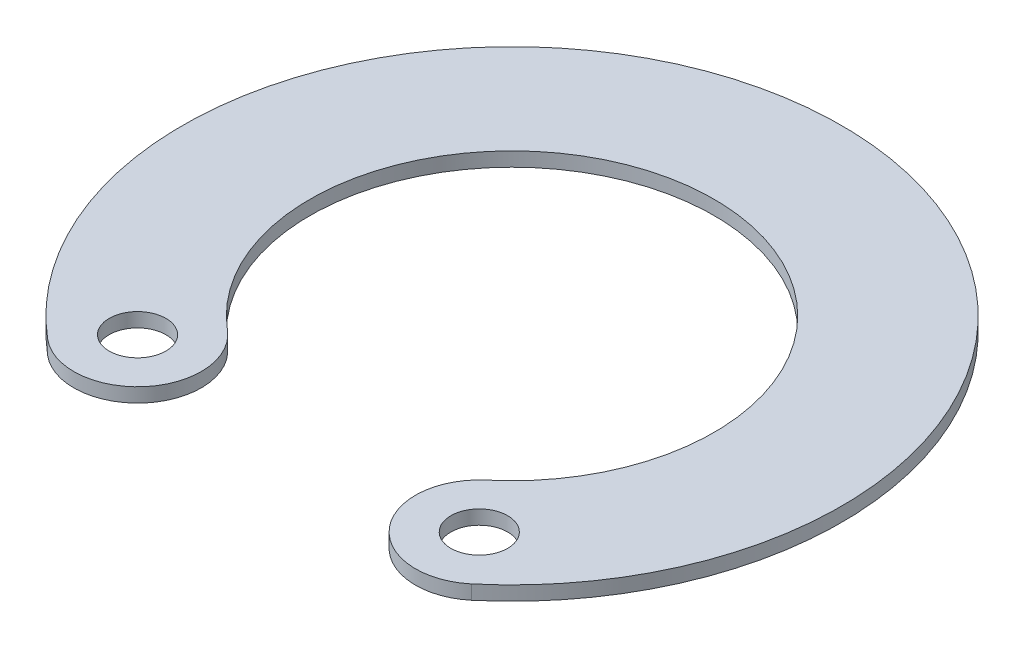
ISO-10303-21;
HEADER;
FILE_DESCRIPTION(('STEP AP214'),'2;1');
FILE_NAME('part.step','',(''),(''),'','','');
FILE_SCHEMA(('AUTOMOTIVE_DESIGN { 1 0 10303 214 1 1 1 1 }'));
ENDSEC;
DATA;
#1=APPLICATION_CONTEXT('core data for automotive mechanical design processes');
#2=APPLICATION_PROTOCOL_DEFINITION('international standard','automotive_design',2000,#1);
#3=PRODUCT_CONTEXT('',#1,'mechanical');
#4=PRODUCT('Part','Part','',(#3));
#5=PRODUCT_RELATED_PRODUCT_CATEGORY('part','',(#4));
#6=PRODUCT_DEFINITION_FORMATION('','',#4);
#7=PRODUCT_DEFINITION_CONTEXT('part definition',#1,'design');
#8=PRODUCT_DEFINITION('design','',#6,#7);
#9=PRODUCT_DEFINITION_SHAPE('','',#8);
#10=(LENGTH_UNIT() NAMED_UNIT(*) SI_UNIT(.MILLI.,.METRE.));
#11=(NAMED_UNIT(*) PLANE_ANGLE_UNIT() SI_UNIT($,.RADIAN.));
#12=(NAMED_UNIT(*) SI_UNIT($,.STERADIAN.) SOLID_ANGLE_UNIT());
#13=UNCERTAINTY_MEASURE_WITH_UNIT(LENGTH_MEASURE(1.E-05),#10,'distance_accuracy_value','');
#14=(GEOMETRIC_REPRESENTATION_CONTEXT(3) GLOBAL_UNCERTAINTY_ASSIGNED_CONTEXT((#13)) GLOBAL_UNIT_ASSIGNED_CONTEXT((#10,
#11,#12)) REPRESENTATION_CONTEXT('',''));
#15=CARTESIAN_POINT('',(0.,0.,0.));
#16=DIRECTION('',(0.,0.,1.));
#17=DIRECTION('',(1.,0.,0.));
#18=AXIS2_PLACEMENT_3D('',#15,#16,#17);
#19=CARTESIAN_POINT('',(1.20522676816226,0.2,1.43633333084808));
#20=DIRECTION('',(0.,1.,0.));
#21=DIRECTION('',(0.,0.,1.));
#22=AXIS2_PLACEMENT_3D('',#19,#20,#21);
#23=PLANE('',#22);
#24=CARTESIAN_POINT('',(-2.41045353632453,0.2,2.87266666169616));
#25=DIRECTION('',(0.,1.,0.));
#26=DIRECTION('',(0.,0.,1.));
#27=AXIS2_PLACEMENT_3D('',#24,#25,#26);
#28=CIRCLE('',#27,0.4);
#29=CARTESIAN_POINT('',(-2.41045353632453,0.2,3.27266666169617));
#30=VERTEX_POINT('',#29);
#31=EDGE_CURVE('E99',#30,#30,#28,.T.);
#32=ORIENTED_EDGE('',*,*,#31,.F.);
#33=EDGE_LOOP('',(#32));
#34=FACE_BOUND('',#33,.T.);
#35=CARTESIAN_POINT('',(2.41045353632453,0.2,2.87266666169616));
#36=DIRECTION('',(0.,1.,0.));
#37=DIRECTION('',(0.,0.,1.));
#38=AXIS2_PLACEMENT_3D('',#35,#36,#37);
#39=CIRCLE('',#38,0.9);
#40=CARTESIAN_POINT('',(1.83194468760664,0.2,2.18322666288909));
#41=VERTEX_POINT('',#40);
#42=CARTESIAN_POINT('',(2.98896238504241,0.2,3.56210666050324));
#43=VERTEX_POINT('',#42);
#44=EDGE_CURVE('E84',#41,#43,#39,.T.);
#45=ORIENTED_EDGE('',*,*,#44,.T.);
#46=CARTESIAN_POINT('',(0.,0.2,0.));
#47=DIRECTION('',(0.,1.,0.));
#48=DIRECTION('',(0.,0.,1.));
#49=AXIS2_PLACEMENT_3D('',#46,#47,#48);
#50=CIRCLE('',#49,4.65);
#51=CARTESIAN_POINT('',(-2.98896238504242,0.2,3.56210666050324));
#52=VERTEX_POINT('',#51);
#53=EDGE_CURVE('E79',#43,#52,#50,.T.);
#54=ORIENTED_EDGE('',*,*,#53,.T.);
#55=CARTESIAN_POINT('',(-2.41045353632453,0.2,2.87266666169616));
#56=DIRECTION('',(0.,1.,0.));
#57=DIRECTION('',(0.,0.,1.));
#58=AXIS2_PLACEMENT_3D('',#55,#56,#57);
#59=CIRCLE('',#58,0.9);
#60=CARTESIAN_POINT('',(-1.83194468760664,0.2,2.18322666288909));
#61=VERTEX_POINT('',#60);
#62=EDGE_CURVE('E82',#52,#61,#59,.T.);
#63=ORIENTED_EDGE('',*,*,#62,.T.);
#64=CARTESIAN_POINT('',(0.,0.2,0.));
#65=DIRECTION('',(0.,-1.,0.));
#66=DIRECTION('',(0.,0.,1.));
#67=AXIS2_PLACEMENT_3D('',#64,#65,#66);
#68=CIRCLE('',#67,2.85);
#69=EDGE_CURVE('E49',#61,#41,#68,.T.);
#70=ORIENTED_EDGE('',*,*,#69,.T.);
#71=EDGE_LOOP('',(#45,#54,#63,#70));
#72=FACE_BOUND('',#71,.T.);
#73=CARTESIAN_POINT('',(2.41045353632453,0.2,2.87266666169616));
#74=DIRECTION('',(0.,1.,0.));
#75=DIRECTION('',(0.,0.,1.));
#76=AXIS2_PLACEMENT_3D('',#73,#74,#75);
#77=CIRCLE('',#76,0.4);
#78=CARTESIAN_POINT('',(2.41045353632453,0.2,3.27266666169617));
#79=VERTEX_POINT('',#78);
#80=EDGE_CURVE('E114',#79,#79,#77,.T.);
#81=ORIENTED_EDGE('',*,*,#80,.F.);
#82=EDGE_LOOP('',(#81));
#83=FACE_BOUND('',#82,.T.);
#84=ADVANCED_FACE('F32',(#34,#72,#83),#23,.T.);
#85=CARTESIAN_POINT('',(1.20522676816226,0.,1.43633333084808));
#86=DIRECTION('',(0.,1.,0.));
#87=DIRECTION('',(0.,0.,1.));
#88=AXIS2_PLACEMENT_3D('',#85,#86,#87);
#89=PLANE('',#88);
#90=CARTESIAN_POINT('',(2.41045353632453,0.,2.87266666169616));
#91=DIRECTION('',(0.,1.,0.));
#92=DIRECTION('',(0.,0.,1.));
#93=AXIS2_PLACEMENT_3D('',#90,#91,#92);
#94=CIRCLE('',#93,0.9);
#95=CARTESIAN_POINT('',(1.83194468760664,0.,2.18322666288909));
#96=VERTEX_POINT('',#95);
#97=CARTESIAN_POINT('',(2.98896238504241,0.,3.56210666050324));
#98=VERTEX_POINT('',#97);
#99=EDGE_CURVE('E96',#96,#98,#94,.T.);
#100=ORIENTED_EDGE('',*,*,#99,.F.);
#101=CARTESIAN_POINT('',(0.,0.,0.));
#102=DIRECTION('',(0.,-1.,0.));
#103=DIRECTION('',(0.,0.,1.));
#104=AXIS2_PLACEMENT_3D('',#101,#102,#103);
#105=CIRCLE('',#104,2.85);
#106=CARTESIAN_POINT('',(-1.83194468760664,0.,2.18322666288909));
#107=VERTEX_POINT('',#106);
#108=EDGE_CURVE('E72',#107,#96,#105,.T.);
#109=ORIENTED_EDGE('',*,*,#108,.F.);
#110=CARTESIAN_POINT('',(-2.41045353632453,0.,2.87266666169616));
#111=DIRECTION('',(0.,1.,0.));
#112=DIRECTION('',(0.,0.,1.));
#113=AXIS2_PLACEMENT_3D('',#110,#111,#112);
#114=CIRCLE('',#113,0.9);
#115=CARTESIAN_POINT('',(-2.98896238504242,0.,3.56210666050324));
#116=VERTEX_POINT('',#115);
#117=EDGE_CURVE('E66',#116,#107,#114,.T.);
#118=ORIENTED_EDGE('',*,*,#117,.F.);
#119=CARTESIAN_POINT('',(0.,0.,0.));
#120=DIRECTION('',(0.,1.,0.));
#121=DIRECTION('',(0.,0.,1.));
#122=AXIS2_PLACEMENT_3D('',#119,#120,#121);
#123=CIRCLE('',#122,4.65);
#124=EDGE_CURVE('E88',#98,#116,#123,.T.);
#125=ORIENTED_EDGE('',*,*,#124,.F.);
#126=EDGE_LOOP('',(#100,#109,#118,#125));
#127=FACE_BOUND('',#126,.T.);
#128=CARTESIAN_POINT('',(-2.41045353632453,0.,2.87266666169616));
#129=DIRECTION('',(0.,1.,0.));
#130=DIRECTION('',(0.,0.,1.));
#131=AXIS2_PLACEMENT_3D('',#128,#129,#130);
#132=CIRCLE('',#131,0.4);
#133=CARTESIAN_POINT('',(-2.41045353632453,0.,3.27266666169617));
#134=VERTEX_POINT('',#133);
#135=EDGE_CURVE('E111',#134,#134,#132,.T.);
#136=ORIENTED_EDGE('',*,*,#135,.T.);
#137=EDGE_LOOP('',(#136));
#138=FACE_BOUND('',#137,.T.);
#139=CARTESIAN_POINT('',(2.41045353632453,0.,2.87266666169616));
#140=DIRECTION('',(0.,1.,0.));
#141=DIRECTION('',(0.,0.,1.));
#142=AXIS2_PLACEMENT_3D('',#139,#140,#141);
#143=CIRCLE('',#142,0.4);
#144=CARTESIAN_POINT('',(2.41045353632453,0.,3.27266666169617));
#145=VERTEX_POINT('',#144);
#146=EDGE_CURVE('E117',#145,#145,#143,.T.);
#147=ORIENTED_EDGE('',*,*,#146,.T.);
#148=EDGE_LOOP('',(#147));
#149=FACE_BOUND('',#148,.T.);
#150=ADVANCED_FACE('F107',(#127,#138,#149),#89,.F.);
#151=CARTESIAN_POINT('',(2.41045353632453,0.2,2.87266666169616));
#152=DIRECTION('',(0.,-1.,0.));
#153=DIRECTION('',(0.,0.,-1.));
#154=AXIS2_PLACEMENT_3D('',#151,#152,#153);
#155=CYLINDRICAL_SURFACE('',#154,0.9);
#156=ORIENTED_EDGE('',*,*,#99,.T.);
#157=DIRECTION('',(0.,-1.,0.));
#158=VECTOR('',#157,1.);
#159=CARTESIAN_POINT('',(2.98896238504241,0.2,3.56210666050324));
#160=LINE('',#159,#158);
#161=EDGE_CURVE('E11',#43,#98,#160,.T.);
#162=ORIENTED_EDGE('',*,*,#161,.F.);
#163=ORIENTED_EDGE('',*,*,#44,.F.);
#164=DIRECTION('',(0.,-1.,0.));
#165=VECTOR('',#164,1.);
#166=CARTESIAN_POINT('',(1.83194468760664,0.2,2.18322666288909));
#167=LINE('',#166,#165);
#168=EDGE_CURVE('E92',#41,#96,#167,.T.);
#169=ORIENTED_EDGE('',*,*,#168,.T.);
#170=EDGE_LOOP('',(#156,#162,#163,#169));
#171=FACE_BOUND('',#170,.T.);
#172=ADVANCED_FACE('F34',(#171),#155,.T.);
#173=CARTESIAN_POINT('',(0.,0.2,0.));
#174=DIRECTION('',(0.,-1.,0.));
#175=DIRECTION('',(0.,0.,-1.));
#176=AXIS2_PLACEMENT_3D('',#173,#174,#175);
#177=CYLINDRICAL_SURFACE('',#176,4.65);
#178=ORIENTED_EDGE('',*,*,#124,.T.);
#179=DIRECTION('',(0.,-1.,0.));
#180=VECTOR('',#179,1.);
#181=CARTESIAN_POINT('',(-2.98896238504242,0.2,3.56210666050324));
#182=LINE('',#181,#180);
#183=EDGE_CURVE('E41',#52,#116,#182,.T.);
#184=ORIENTED_EDGE('',*,*,#183,.F.);
#185=ORIENTED_EDGE('',*,*,#53,.F.);
#186=ORIENTED_EDGE('',*,*,#161,.T.);
#187=EDGE_LOOP('',(#178,#184,#185,#186));
#188=FACE_BOUND('',#187,.T.);
#189=ADVANCED_FACE('F87',(#188),#177,.T.);
#190=CARTESIAN_POINT('',(-2.41045353632453,0.2,2.87266666169616));
#191=DIRECTION('',(0.,-1.,0.));
#192=DIRECTION('',(0.,0.,-1.));
#193=AXIS2_PLACEMENT_3D('',#190,#191,#192);
#194=CYLINDRICAL_SURFACE('',#193,0.9);
#195=ORIENTED_EDGE('',*,*,#117,.T.);
#196=DIRECTION('',(0.,-1.,0.));
#197=VECTOR('',#196,1.);
#198=CARTESIAN_POINT('',(-1.83194468760664,0.2,2.18322666288909));
#199=LINE('',#198,#197);
#200=EDGE_CURVE('E89',#61,#107,#199,.T.);
#201=ORIENTED_EDGE('',*,*,#200,.F.);
#202=ORIENTED_EDGE('',*,*,#62,.F.);
#203=ORIENTED_EDGE('',*,*,#183,.T.);
#204=EDGE_LOOP('',(#195,#201,#202,#203));
#205=FACE_BOUND('',#204,.T.);
#206=ADVANCED_FACE('F90',(#205),#194,.T.);
#207=CARTESIAN_POINT('',(0.,0.2,0.));
#208=DIRECTION('',(0.,-1.,0.));
#209=DIRECTION('',(0.,0.,-1.));
#210=AXIS2_PLACEMENT_3D('',#207,#208,#209);
#211=CYLINDRICAL_SURFACE('',#210,2.85);
#212=ORIENTED_EDGE('',*,*,#108,.T.);
#213=ORIENTED_EDGE('',*,*,#168,.F.);
#214=ORIENTED_EDGE('',*,*,#69,.F.);
#215=ORIENTED_EDGE('',*,*,#200,.T.);
#216=EDGE_LOOP('',(#212,#213,#214,#215));
#217=FACE_BOUND('',#216,.T.);
#218=ADVANCED_FACE('F104',(#217),#211,.F.);
#219=CARTESIAN_POINT('',(-2.41045353632453,0.2,2.87266666169616));
#220=DIRECTION('',(0.,-1.,0.));
#221=DIRECTION('',(0.,0.,-1.));
#222=AXIS2_PLACEMENT_3D('',#219,#220,#221);
#223=CYLINDRICAL_SURFACE('',#222,0.4);
#224=ORIENTED_EDGE('',*,*,#31,.T.);
#225=EDGE_LOOP('',(#224));
#226=FACE_BOUND('',#225,.T.);
#227=ORIENTED_EDGE('',*,*,#135,.F.);
#228=EDGE_LOOP('',(#227));
#229=FACE_BOUND('',#228,.T.);
#230=ADVANCED_FACE('F134',(#226,#229),#223,.F.);
#231=CARTESIAN_POINT('',(2.41045353632453,0.2,2.87266666169616));
#232=DIRECTION('',(0.,-1.,0.));
#233=DIRECTION('',(0.,0.,-1.));
#234=AXIS2_PLACEMENT_3D('',#231,#232,#233);
#235=CYLINDRICAL_SURFACE('',#234,0.4);
#236=ORIENTED_EDGE('',*,*,#80,.T.);
#237=EDGE_LOOP('',(#236));
#238=FACE_BOUND('',#237,.T.);
#239=ORIENTED_EDGE('',*,*,#146,.F.);
#240=EDGE_LOOP('',(#239));
#241=FACE_BOUND('',#240,.T.);
#242=ADVANCED_FACE('F123',(#238,#241),#235,.F.);
#243=CLOSED_SHELL('',(#84,#150,#172,#189,#206,#218,#230,#242));
#244=MANIFOLD_SOLID_BREP('B2',#243);
#245=ADVANCED_BREP_SHAPE_REPRESENTATION('',(#18,#244),#14);
#246=SHAPE_DEFINITION_REPRESENTATION(#9,#245);
ENDSEC;
END-ISO-10303-21;
